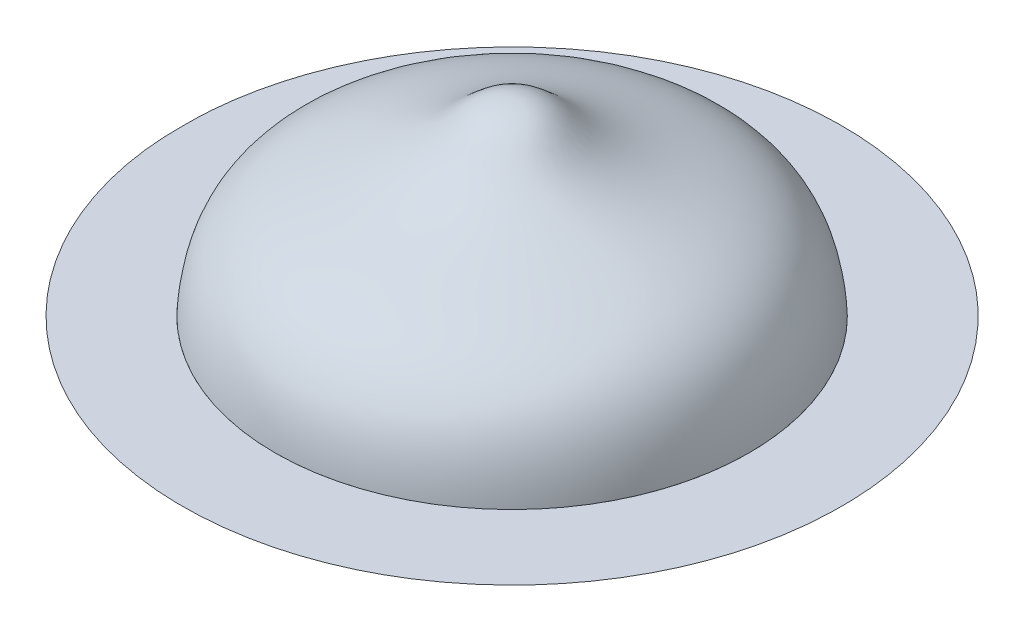
ISO-10303-21;
HEADER;
FILE_DESCRIPTION(('STEP AP214'),'2;1');
FILE_NAME('part.step','',(''),(''),'','','');
FILE_SCHEMA(('AUTOMOTIVE_DESIGN { 1 0 10303 214 1 1 1 1 }'));
ENDSEC;
DATA;
#1=APPLICATION_CONTEXT('core data for automotive mechanical design processes');
#2=APPLICATION_PROTOCOL_DEFINITION('international standard','automotive_design',2000,#1);
#3=PRODUCT_CONTEXT('',#1,'mechanical');
#4=PRODUCT('Part','Part','',(#3));
#5=PRODUCT_RELATED_PRODUCT_CATEGORY('part','',(#4));
#6=PRODUCT_DEFINITION_FORMATION('','',#4);
#7=PRODUCT_DEFINITION_CONTEXT('part definition',#1,'design');
#8=PRODUCT_DEFINITION('design','',#6,#7);
#9=PRODUCT_DEFINITION_SHAPE('','',#8);
#10=(LENGTH_UNIT() NAMED_UNIT(*) SI_UNIT(.MILLI.,.METRE.));
#11=(NAMED_UNIT(*) PLANE_ANGLE_UNIT() SI_UNIT($,.RADIAN.));
#12=(NAMED_UNIT(*) SI_UNIT($,.STERADIAN.) SOLID_ANGLE_UNIT());
#13=UNCERTAINTY_MEASURE_WITH_UNIT(LENGTH_MEASURE(1.E-05),#10,'distance_accuracy_value','');
#14=(GEOMETRIC_REPRESENTATION_CONTEXT(3) GLOBAL_UNCERTAINTY_ASSIGNED_CONTEXT((#13)) GLOBAL_UNIT_ASSIGNED_CONTEXT((#10,
#11,#12)) REPRESENTATION_CONTEXT('',''));
#15=CARTESIAN_POINT('',(0.,0.,0.));
#16=DIRECTION('',(0.,0.,1.));
#17=DIRECTION('',(1.,0.,0.));
#18=AXIS2_PLACEMENT_3D('',#15,#16,#17);
#19=CARTESIAN_POINT('',(-31.5000010384926,0.,-0.702442629565759));
#20=DIRECTION('',(0.,-1.,0.));
#21=DIRECTION('',(1.47840205385541E-06,0.,0.999999999998907));
#22=AXIS2_PLACEMENT_3D('',#19,#20,#21);
#23=PLANE('',#22);
#24=CARTESIAN_POINT('',(-31.5,0.,0.));
#25=CARTESIAN_POINT('',(-31.4999989723356,0.,0.695118317598675));
#26=CARTESIAN_POINT('',(-31.4570912975858,0.,2.01598544667719));
#27=CARTESIAN_POINT('',(-30.9447625205452,0.,7.39621287111648));
#28=CARTESIAN_POINT('',(-28.8257397151246,0.,13.77203228028));
#29=CARTESIAN_POINT('',(-23.7600338303516,0.,21.0886439731864));
#30=CARTESIAN_POINT('',(-18.4789190201631,0.,25.9032353319399));
#31=CARTESIAN_POINT('',(-12.6395260495209,0.,29.0400697752032));
#32=CARTESIAN_POINT('',(-6.62813009475314,0.,31.0046148053599));
#33=CARTESIAN_POINT('',(0.758780937009241,0.,31.91463146498));
#34=CARTESIAN_POINT('',(9.25994891344295,0.,30.5537947299985));
#35=CARTESIAN_POINT('',(18.3178526727276,0.,26.2652762197616));
#36=CARTESIAN_POINT('',(25.0773141392385,0.,19.9127795941795));
#37=CARTESIAN_POINT('',(29.0278029272143,0.,12.7522877585882));
#38=CARTESIAN_POINT('',(31.653335308998,0.,4.55017427130507));
#39=CARTESIAN_POINT('',(31.8115007170997,0.,-3.00706943298309));
#40=CARTESIAN_POINT('',(29.6721380680337,0.,-11.1221233052519));
#41=CARTESIAN_POINT('',(26.2652715640952,0.,-18.3178604470281));
#42=CARTESIAN_POINT('',(19.9127690324603,0.,-25.0773225509213));
#43=CARTESIAN_POINT('',(12.7522794316399,0.,-29.0278061634878));
#44=CARTESIAN_POINT('',(6.50354589033987,0.,-31.0280516188028));
#45=CARTESIAN_POINT('',(-0.0948915832213037,0.,-31.8024670646898));
#46=CARTESIAN_POINT('',(-6.56652307169253,0.,-31.0140573500785));
#47=CARTESIAN_POINT('',(-12.3984290561074,0.,-29.1274644748788));
#48=CARTESIAN_POINT('',(-18.0145562620889,0.,-26.188539648483));
#49=CARTESIAN_POINT('',(-23.7269730514179,0.,-21.2257916762233));
#50=CARTESIAN_POINT('',(-28.9294339640006,0.,-13.6547569000277));
#51=CARTESIAN_POINT('',(-30.9956505259154,0.,-6.9560869306962));
#52=CARTESIAN_POINT('',(-31.4585890748902,0.,-1.96371258383298));
#53=CARTESIAN_POINT('',(-31.5000010384926,0.,-0.702442629565759));
#54=CARTESIAN_POINT('',(-31.5,0.,0.));
#55=B_SPLINE_CURVE_WITH_KNOTS('',3,(#24,#25,#26,#27,#28,#29,#30,#31,#32,#33,#34,#35,#36,#37,#38,
#39,#40,#41,#42,#43,#44,#45,#46,#47,#48,#49,#50,#51,#52,#53,#54),.UNSPECIFIED.,.T.,.F.,(4,1,1,1,
1,1,1,1,1,1,1,1,1,1,1,1,1,1,1,1,1,1,1,1,1,1,1,1,4),(0.,0.0105359461236555,0.0200199248918013,
0.0818804187444345,0.110479941634575,0.15436179535329,0.189191911241314,0.210350636592251,0.25,
0.301152451862418,0.339184000340445,0.400815467433343,0.439191948128887,0.462240806951031,
0.531005413815135,0.551152451862418,0.589184067442989,0.650815534537319,0.689192015228312,
0.71224080695103,0.75,0.78920006777765,0.810320073913064,0.842692460370817,0.884777181046838,
0.924031285061479,0.980882441295685,0.98935303888174,1.),.UNSPECIFIED.);
#56=CARTESIAN_POINT('',(-31.5,0.,0.));
#57=VERTEX_POINT('',#56);
#58=EDGE_CURVE('E12',#57,#57,#55,.T.);
#59=ORIENTED_EDGE('',*,*,#58,.T.);
#60=EDGE_LOOP('',(#59));
#61=FACE_BOUND('',#60,.T.);
#62=CARTESIAN_POINT('',(-43.7520822297668,0.,0.00072946480957146));
#63=CARTESIAN_POINT('',(-43.7521272526842,0.,0.967267427531974));
#64=CARTESIAN_POINT('',(-43.7332019229225,0.,2.80504351204582));
#65=CARTESIAN_POINT('',(-43.0385749569401,0.,10.2884929747753));
#66=CARTESIAN_POINT('',(-40.0834254469766,0.,19.1520691948034));
#67=CARTESIAN_POINT('',(-33.036497041297,0.,29.3224040156928));
#68=CARTESIAN_POINT('',(-25.6946580670852,0.,36.0178430781361));
#69=CARTESIAN_POINT('',(-17.5752956826822,0.,40.3808069404587));
#70=CARTESIAN_POINT('',(-9.21515921195781,0.,43.1072170658652));
#71=CARTESIAN_POINT('',(1.05590785460209,0.,44.3876756791043));
#72=CARTESIAN_POINT('',(12.8738095851353,0.,42.4769569466552));
#73=CARTESIAN_POINT('',(25.4719483781031,0.,36.5231154663437));
#74=CARTESIAN_POINT('',(34.8731396093607,0.,27.6912834223713));
#75=CARTESIAN_POINT('',(40.3581408350888,0.,17.7306404280051));
#76=CARTESIAN_POINT('',(44.0085457809027,0.,6.32597045992959));
#77=CARTESIAN_POINT('',(44.2312336117255,0.,-4.18094719761034));
#78=CARTESIAN_POINT('',(41.2531393536343,0.,-15.4632585444453));
#79=CARTESIAN_POINT('',(36.5234471081046,0.,-25.4714753700541));
#80=CARTESIAN_POINT('',(27.6917307002654,0.,-34.8727838772375));
#81=CARTESIAN_POINT('',(17.731163642741,0.,-40.3579100548235));
#82=CARTESIAN_POINT('',(9.04261762989609,0.,-43.1390637778379));
#83=CARTESIAN_POINT('',(-0.13158696809018,0.,-44.2296191125735));
#84=CARTESIAN_POINT('',(-9.12921221230599,0.,-43.1204789845047));
#85=CARTESIAN_POINT('',(-17.2395515847791,0.,-40.502103877794));
#86=CARTESIAN_POINT('',(-25.0484728782732,0.,-36.4149434070975));
#87=CARTESIAN_POINT('',(-32.9899721522219,0.,-29.5135601590453));
#88=CARTESIAN_POINT('',(-40.2272109193892,0.,-18.9896717241794));
#89=CARTESIAN_POINT('',(-43.111280606535,0.,-9.67638549986487));
#90=CARTESIAN_POINT('',(-43.7337050616547,0.,-2.73106499738066));
#91=CARTESIAN_POINT('',(-43.7520367324527,0.,-0.975992700210143));
#92=CARTESIAN_POINT('',(-43.7520822297668,0.,0.00072946480957146));
#93=B_SPLINE_CURVE_WITH_KNOTS('',3,(#62,#63,#64,#65,#66,#67,#68,#69,#70,#71,#72,#73,#74,#75,#76,
#77,#78,#79,#80,#81,#82,#83,#84,#85,#86,#87,#88,#89,#90,#91,#92),.UNSPECIFIED.,.T.,.F.,(4,1,1,1,
1,1,1,1,1,1,1,1,1,1,1,1,1,1,1,1,1,1,1,1,1,1,1,1,4),(0.,0.0105359461236555,0.0200199248918013,
0.0818804187444345,0.110479941634575,0.15436179535329,0.189191911241314,0.210350636592251,0.25,
0.301152451862418,0.339184000340445,0.400815467433343,0.439191948128887,0.462240806951031,
0.531005413815135,0.551152451862418,0.589184067442989,0.650815534537319,0.689192015228312,
0.71224080695103,0.75,0.78920006777765,0.810320073913064,0.842692460370817,0.884777181046838,
0.924031285061479,0.980882441295685,0.98935303888174,1.),.UNSPECIFIED.);
#94=CARTESIAN_POINT('',(-43.7520822297668,0.,0.00072946480957146));
#95=VERTEX_POINT('',#94);
#96=EDGE_CURVE('E68',#95,#95,#93,.F.);
#97=ORIENTED_EDGE('',*,*,#96,.T.);
#98=EDGE_LOOP('',(#97));
#99=FACE_BOUND('',#98,.T.);
#100=ADVANCED_FACE('F67',(#61,#99),#23,.T.);
#101=OPEN_SHELL('',(#100));
#102=SHELL_BASED_SURFACE_MODEL('B2',(#101));
#103=CARTESIAN_POINT('',(31.5,0.,0.));
#104=CARTESIAN_POINT('',(31.0384816066645,6.45024292906932,0.));
#105=CARTESIAN_POINT('',(25.578767023799,15.0701621582805,0.));
#106=CARTESIAN_POINT('',(10.751491586031,17.1368124459304,0.));
#107=CARTESIAN_POINT('',(4.09022478631182,24.302680673632,0.));
#108=CARTESIAN_POINT('',(1.3714928801771,25.,0.));
#109=CARTESIAN_POINT('',(0.,25.,0.));
#110=B_SPLINE_CURVE_WITH_KNOTS('',3,(#103,#104,#105,#106,#107,#108,#109),.UNSPECIFIED.,.F.,.F.,
(4,1,1,1,4),(0.,0.324542994191198,0.804976685270846,0.908754137946257,1.),.UNSPECIFIED.);
#111=CARTESIAN_POINT('',(0.,25.,0.));
#112=DIRECTION('',(0.,1.,0.));
#113=AXIS1_PLACEMENT('',#111,#112);
#114=SURFACE_OF_REVOLUTION('',#110,#113);
#115=CARTESIAN_POINT('',(0.,25.,0.));
#116=VERTEX_POINT('',#115);
#117=VERTEX_LOOP('',#116);
#118=FACE_BOUND('',#117,.T.);
#119=CARTESIAN_POINT('',(0.,0.,0.));
#120=DIRECTION('',(0.,1.,0.));
#121=DIRECTION('',(-1.,0.,0.));
#122=AXIS2_PLACEMENT_3D('',#119,#120,#121);
#123=CIRCLE('',#122,31.5);
#124=CARTESIAN_POINT('',(-31.5,0.,0.));
#125=VERTEX_POINT('',#124);
#126=EDGE_CURVE('E121',#125,#125,#123,.T.);
#127=ORIENTED_EDGE('',*,*,#126,.T.);
#128=EDGE_LOOP('',(#127));
#129=FACE_BOUND('',#128,.T.);
#130=ADVANCED_FACE('F102',(#118,#129),#114,.T.);
#131=CARTESIAN_POINT('',(0.,10.,0.));
#132=CARTESIAN_POINT('',(11.1572008384121,9.49282522301715,0.));
#133=CARTESIAN_POINT('',(24.4624394265557,10.5880967466127,0.));
#134=CARTESIAN_POINT('',(30.5,0.,0.));
#135=B_SPLINE_CURVE_WITH_KNOTS('',3,(#131,#132,#133,#134),.UNSPECIFIED.,.F.,.F.,(4,4),(0.,1.),.UNSPECIFIED.);
#136=CARTESIAN_POINT('',(0.,25.,0.));
#137=DIRECTION('',(0.,1.,0.));
#138=AXIS1_PLACEMENT('',#136,#137);
#139=SURFACE_OF_REVOLUTION('',#135,#138);
#140=CARTESIAN_POINT('',(0.,0.245606026306522,0.));
#141=DIRECTION('',(0.,1.,0.));
#142=DIRECTION('',(-1.,0.,0.));
#143=AXIS2_PLACEMENT_3D('',#140,#141,#142);
#144=CIRCLE('',#143,30.3574163670553);
#145=CARTESIAN_POINT('',(-30.3574163670553,0.245606026306518,0.));
#146=VERTEX_POINT('',#145);
#147=EDGE_CURVE('E65',#146,#146,#144,.F.);
#148=ORIENTED_EDGE('',*,*,#147,.T.);
#149=EDGE_LOOP('',(#148));
#150=FACE_BOUND('',#149,.T.);
#151=CARTESIAN_POINT('',(0.,10.,0.));
#152=VERTEX_POINT('',#151);
#153=VERTEX_LOOP('',#152);
#154=FACE_BOUND('',#153,.T.);
#155=ADVANCED_FACE('F118',(#150,#154),#139,.T.);
#156=CARTESIAN_POINT('',(31.5,0.,0.));
#157=DIRECTION('',(0.,1.,0.));
#158=DIRECTION('',(-1.,0.,0.));
#159=AXIS2_PLACEMENT_3D('',#156,#157,#158);
#160=PLANE('',#159);
#161=CARTESIAN_POINT('',(0.,0.,0.));
#162=DIRECTION('',(0.,1.,0.));
#163=DIRECTION('',(-1.,0.,0.));
#164=AXIS2_PLACEMENT_3D('',#161,#162,#163);
#165=CIRCLE('',#164,30.7878623057612);
#166=CARTESIAN_POINT('',(-30.7878623057612,0.,0.));
#167=VERTEX_POINT('',#166);
#168=EDGE_CURVE('E110',#167,#167,#165,.T.);
#169=ORIENTED_EDGE('',*,*,#168,.T.);
#170=EDGE_LOOP('',(#169));
#171=FACE_BOUND('',#170,.T.);
#172=ORIENTED_EDGE('',*,*,#126,.F.);
#173=EDGE_LOOP('',(#172));
#174=FACE_BOUND('',#173,.T.);
#175=ADVANCED_FACE('F141',(#171,#174),#160,.F.);
#176=CARTESIAN_POINT('',(0.,0.499999999999997,0.));
#177=DIRECTION('',(0.,1.,0.));
#178=DIRECTION('',(-1.,0.,0.));
#179=AXIS2_PLACEMENT_3D('',#176,#177,#178);
#180=TOROIDAL_SURFACE('',#179,30.7878623057612,0.5);
#181=ORIENTED_EDGE('',*,*,#147,.F.);
#182=EDGE_LOOP('',(#181));
#183=FACE_BOUND('',#182,.T.);
#184=ORIENTED_EDGE('',*,*,#168,.F.);
#185=EDGE_LOOP('',(#184));
#186=FACE_BOUND('',#185,.T.);
#187=ADVANCED_FACE('F104',(#183,#186),#180,.T.);
#188=CLOSED_SHELL('',(#130,#155,#175,#187));
#189=MANIFOLD_SOLID_BREP('B7',#188);
#190=ADVANCED_BREP_SHAPE_REPRESENTATION('',(#18,#189),#14);
#191=MANIFOLD_SURFACE_SHAPE_REPRESENTATION('',(#18,#102),#14);
#192=SHAPE_REPRESENTATION('',(#18),#14);
#193=SHAPE_DEFINITION_REPRESENTATION(#9,#192);
#194=SHAPE_REPRESENTATION_RELATIONSHIP('','',#192,#190);
#195=SHAPE_REPRESENTATION_RELATIONSHIP('','',#192,#191);
ENDSEC;
END-ISO-10303-21;
